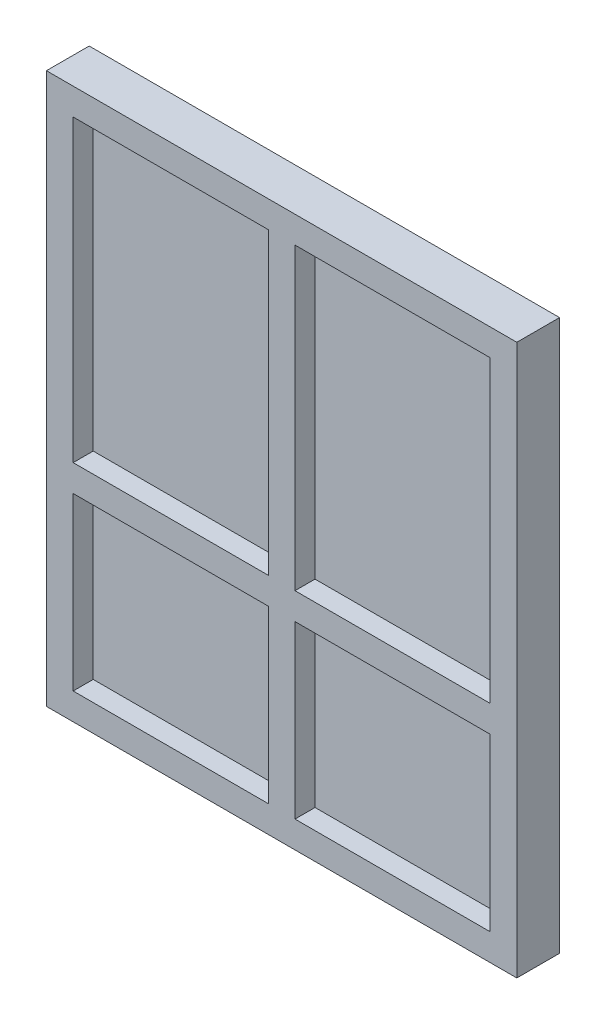
ISO-10303-21;
HEADER;
FILE_DESCRIPTION(('STEP AP214'),'2;1');
FILE_NAME('part.step','',(''),(''),'','','');
FILE_SCHEMA(('AUTOMOTIVE_DESIGN { 1 0 10303 214 1 1 1 1 }'));
ENDSEC;
DATA;
#1=APPLICATION_CONTEXT('core data for automotive mechanical design processes');
#2=APPLICATION_PROTOCOL_DEFINITION('international standard','automotive_design',2000,#1);
#3=PRODUCT_CONTEXT('',#1,'mechanical');
#4=PRODUCT('Part','Part','',(#3));
#5=PRODUCT_RELATED_PRODUCT_CATEGORY('part','',(#4));
#6=PRODUCT_DEFINITION_FORMATION('','',#4);
#7=PRODUCT_DEFINITION_CONTEXT('part definition',#1,'design');
#8=PRODUCT_DEFINITION('design','',#6,#7);
#9=PRODUCT_DEFINITION_SHAPE('','',#8);
#10=(LENGTH_UNIT() NAMED_UNIT(*) SI_UNIT(.MILLI.,.METRE.));
#11=(NAMED_UNIT(*) PLANE_ANGLE_UNIT() SI_UNIT($,.RADIAN.));
#12=(NAMED_UNIT(*) SI_UNIT($,.STERADIAN.) SOLID_ANGLE_UNIT());
#13=UNCERTAINTY_MEASURE_WITH_UNIT(LENGTH_MEASURE(1.E-05),#10,'distance_accuracy_value','');
#14=(GEOMETRIC_REPRESENTATION_CONTEXT(3) GLOBAL_UNCERTAINTY_ASSIGNED_CONTEXT((#13)) GLOBAL_UNIT_ASSIGNED_CONTEXT((#10,
#11,#12)) REPRESENTATION_CONTEXT('',''));
#15=CARTESIAN_POINT('',(0.,0.,0.));
#16=DIRECTION('',(0.,0.,1.));
#17=DIRECTION('',(1.,0.,0.));
#18=AXIS2_PLACEMENT_3D('',#15,#16,#17);
#19=CARTESIAN_POINT('',(100.,1960.,5.));
#20=DIRECTION('',(1.,0.,0.));
#21=DIRECTION('',(0.,1.,0.));
#22=AXIS2_PLACEMENT_3D('',#19,#20,#21);
#23=PLANE('',#22);
#24=DIRECTION('',(0.,-1.,0.));
#25=VECTOR('',#24,1.);
#26=CARTESIAN_POINT('',(100.,1960.,-5.));
#27=LINE('',#26,#25);
#28=CARTESIAN_POINT('',(100.,1960.,-5.));
#29=VERTEX_POINT('',#28);
#30=CARTESIAN_POINT('',(100.,100.,-5.));
#31=VERTEX_POINT('',#30);
#32=EDGE_CURVE('E110',#29,#31,#27,.T.);
#33=ORIENTED_EDGE('',*,*,#32,.T.);
#34=DIRECTION('',(0.,0.,-1.));
#35=VECTOR('',#34,1.);
#36=CARTESIAN_POINT('',(100.,100.,5.));
#37=LINE('',#36,#35);
#38=CARTESIAN_POINT('',(100.,100.,5.));
#39=VERTEX_POINT('',#38);
#40=EDGE_CURVE('E12',#39,#31,#37,.T.);
#41=ORIENTED_EDGE('',*,*,#40,.F.);
#42=DIRECTION('',(0.,-1.,0.));
#43=VECTOR('',#42,1.);
#44=CARTESIAN_POINT('',(100.,1960.,5.));
#45=LINE('',#44,#43);
#46=CARTESIAN_POINT('',(100.,1960.,5.));
#47=VERTEX_POINT('',#46);
#48=EDGE_CURVE('E98',#47,#39,#45,.T.);
#49=ORIENTED_EDGE('',*,*,#48,.F.);
#50=DIRECTION('',(0.,0.,-1.));
#51=VECTOR('',#50,1.);
#52=CARTESIAN_POINT('',(100.,1960.,5.));
#53=LINE('',#52,#51);
#54=EDGE_CURVE('E106',#47,#29,#53,.T.);
#55=ORIENTED_EDGE('',*,*,#54,.T.);
#56=EDGE_LOOP('',(#33,#41,#49,#55));
#57=FACE_BOUND('',#56,.T.);
#58=ADVANCED_FACE('F47',(#57),#23,.F.);
#59=CARTESIAN_POINT('',(100.,100.,5.));
#60=DIRECTION('',(0.,1.,0.));
#61=DIRECTION('',(0.,0.,1.));
#62=AXIS2_PLACEMENT_3D('',#59,#60,#61);
#63=PLANE('',#62);
#64=DIRECTION('',(1.,0.,0.));
#65=VECTOR('',#64,1.);
#66=CARTESIAN_POINT('',(100.,100.,-5.));
#67=LINE('',#66,#65);
#68=CARTESIAN_POINT('',(1660.,100.,-5.));
#69=VERTEX_POINT('',#68);
#70=EDGE_CURVE('E102',#31,#69,#67,.T.);
#71=ORIENTED_EDGE('',*,*,#70,.T.);
#72=DIRECTION('',(0.,0.,-1.));
#73=VECTOR('',#72,1.);
#74=CARTESIAN_POINT('',(1660.,100.,5.));
#75=LINE('',#74,#73);
#76=CARTESIAN_POINT('',(1660.,100.,5.));
#77=VERTEX_POINT('',#76);
#78=EDGE_CURVE('E55',#77,#69,#75,.T.);
#79=ORIENTED_EDGE('',*,*,#78,.F.);
#80=DIRECTION('',(1.,0.,0.));
#81=VECTOR('',#80,1.);
#82=CARTESIAN_POINT('',(100.,100.,5.));
#83=LINE('',#82,#81);
#84=EDGE_CURVE('E93',#39,#77,#83,.T.);
#85=ORIENTED_EDGE('',*,*,#84,.F.);
#86=ORIENTED_EDGE('',*,*,#40,.T.);
#87=EDGE_LOOP('',(#71,#79,#85,#86));
#88=FACE_BOUND('',#87,.T.);
#89=ADVANCED_FACE('F101',(#88),#63,.F.);
#90=CARTESIAN_POINT('',(1660.,1960.,5.));
#91=DIRECTION('',(-1.,0.,0.));
#92=DIRECTION('',(0.,-1.,0.));
#93=AXIS2_PLACEMENT_3D('',#90,#91,#92);
#94=PLANE('',#93);
#95=DIRECTION('',(0.,1.,0.));
#96=VECTOR('',#95,1.);
#97=CARTESIAN_POINT('',(1660.,1960.,-5.));
#98=LINE('',#97,#96);
#99=CARTESIAN_POINT('',(1660.,1960.,-5.));
#100=VERTEX_POINT('',#99);
#101=EDGE_CURVE('E80',#69,#100,#98,.T.);
#102=ORIENTED_EDGE('',*,*,#101,.T.);
#103=DIRECTION('',(0.,0.,-1.));
#104=VECTOR('',#103,1.);
#105=CARTESIAN_POINT('',(1660.,1960.,5.));
#106=LINE('',#105,#104);
#107=CARTESIAN_POINT('',(1660.,1960.,5.));
#108=VERTEX_POINT('',#107);
#109=EDGE_CURVE('E103',#108,#100,#106,.T.);
#110=ORIENTED_EDGE('',*,*,#109,.F.);
#111=DIRECTION('',(0.,1.,0.));
#112=VECTOR('',#111,1.);
#113=CARTESIAN_POINT('',(1660.,1960.,5.));
#114=LINE('',#113,#112);
#115=EDGE_CURVE('E96',#77,#108,#114,.T.);
#116=ORIENTED_EDGE('',*,*,#115,.F.);
#117=ORIENTED_EDGE('',*,*,#78,.T.);
#118=EDGE_LOOP('',(#102,#110,#116,#117));
#119=FACE_BOUND('',#118,.T.);
#120=ADVANCED_FACE('F104',(#119),#94,.F.);
#121=CARTESIAN_POINT('',(100.,1960.,5.));
#122=DIRECTION('',(0.,-1.,0.));
#123=DIRECTION('',(0.,0.,-1.));
#124=AXIS2_PLACEMENT_3D('',#121,#122,#123);
#125=PLANE('',#124);
#126=DIRECTION('',(-1.,0.,0.));
#127=VECTOR('',#126,1.);
#128=CARTESIAN_POINT('',(100.,1960.,-5.));
#129=LINE('',#128,#127);
#130=EDGE_CURVE('E86',#100,#29,#129,.T.);
#131=ORIENTED_EDGE('',*,*,#130,.T.);
#132=ORIENTED_EDGE('',*,*,#54,.F.);
#133=DIRECTION('',(-1.,0.,0.));
#134=VECTOR('',#133,1.);
#135=CARTESIAN_POINT('',(100.,1960.,5.));
#136=LINE('',#135,#134);
#137=EDGE_CURVE('E63',#108,#47,#136,.T.);
#138=ORIENTED_EDGE('',*,*,#137,.F.);
#139=ORIENTED_EDGE('',*,*,#109,.T.);
#140=EDGE_LOOP('',(#131,#132,#138,#139));
#141=FACE_BOUND('',#140,.T.);
#142=ADVANCED_FACE('F117',(#141),#125,.F.);
#143=CARTESIAN_POINT('',(0.,0.,5.));
#144=DIRECTION('',(0.,0.,1.));
#145=DIRECTION('',(1.,0.,0.));
#146=AXIS2_PLACEMENT_3D('',#143,#144,#145);
#147=PLANE('',#146);
#148=ORIENTED_EDGE('',*,*,#48,.T.);
#149=ORIENTED_EDGE('',*,*,#84,.T.);
#150=ORIENTED_EDGE('',*,*,#115,.T.);
#151=ORIENTED_EDGE('',*,*,#137,.T.);
#152=EDGE_LOOP('',(#148,#149,#150,#151));
#153=FACE_BOUND('',#152,.T.);
#154=ADVANCED_FACE('F94',(#153),#147,.T.);
#155=CARTESIAN_POINT('',(0.,0.,-5.));
#156=DIRECTION('',(0.,0.,1.));
#157=DIRECTION('',(1.,0.,0.));
#158=AXIS2_PLACEMENT_3D('',#155,#156,#157);
#159=PLANE('',#158);
#160=ORIENTED_EDGE('',*,*,#32,.F.);
#161=ORIENTED_EDGE('',*,*,#130,.F.);
#162=ORIENTED_EDGE('',*,*,#101,.F.);
#163=ORIENTED_EDGE('',*,*,#70,.F.);
#164=EDGE_LOOP('',(#160,#161,#162,#163));
#165=FACE_BOUND('',#164,.T.);
#166=ADVANCED_FACE('F120',(#165),#159,.F.);
#167=CLOSED_SHELL('',(#58,#89,#120,#142,#154,#166));
#168=MANIFOLD_SOLID_BREP('B2',#167);
#169=CARTESIAN_POINT('',(0.,0.,80.));
#170=DIRECTION('',(0.,0.,1.));
#171=DIRECTION('',(1.,0.,0.));
#172=AXIS2_PLACEMENT_3D('',#169,#170,#171);
#173=PLANE('',#172);
#174=DIRECTION('',(0.,-1.,0.));
#175=VECTOR('',#174,1.);
#176=CARTESIAN_POINT('',(0.,2060.,80.));
#177=LINE('',#176,#175);
#178=CARTESIAN_POINT('',(0.,2060.,80.));
#179=VERTEX_POINT('',#178);
#180=CARTESIAN_POINT('',(0.,0.,80.));
#181=VERTEX_POINT('',#180);
#182=EDGE_CURVE('E437',#179,#181,#177,.T.);
#183=ORIENTED_EDGE('',*,*,#182,.T.);
#184=DIRECTION('',(1.,0.,0.));
#185=VECTOR('',#184,1.);
#186=CARTESIAN_POINT('',(0.,0.,80.));
#187=LINE('',#186,#185);
#188=CARTESIAN_POINT('',(1760.,0.,80.));
#189=VERTEX_POINT('',#188);
#190=EDGE_CURVE('E440',#181,#189,#187,.T.);
#191=ORIENTED_EDGE('',*,*,#190,.T.);
#192=DIRECTION('',(0.,1.,0.));
#193=VECTOR('',#192,1.);
#194=CARTESIAN_POINT('',(1760.,2060.,80.));
#195=LINE('',#194,#193);
#196=CARTESIAN_POINT('',(1760.,2060.,80.));
#197=VERTEX_POINT('',#196);
#198=EDGE_CURVE('E443',#189,#197,#195,.T.);
#199=ORIENTED_EDGE('',*,*,#198,.T.);
#200=DIRECTION('',(-1.,0.,0.));
#201=VECTOR('',#200,1.);
#202=CARTESIAN_POINT('',(0.,2060.,80.));
#203=LINE('',#202,#201);
#204=EDGE_CURVE('E445',#197,#179,#203,.T.);
#205=ORIENTED_EDGE('',*,*,#204,.T.);
#206=EDGE_LOOP('',(#183,#191,#199,#205));
#207=FACE_BOUND('',#206,.T.);
#208=DIRECTION('',(1.,0.,0.));
#209=VECTOR('',#208,1.);
#210=CARTESIAN_POINT('',(100.,100.,80.));
#211=LINE('',#210,#209);
#212=CARTESIAN_POINT('',(100.,100.,80.));
#213=VERTEX_POINT('',#212);
#214=CARTESIAN_POINT('',(830.,100.,80.));
#215=VERTEX_POINT('',#214);
#216=EDGE_CURVE('E408',#213,#215,#211,.T.);
#217=ORIENTED_EDGE('',*,*,#216,.F.);
#218=DIRECTION('',(0.,-1.,0.));
#219=VECTOR('',#218,1.);
#220=CARTESIAN_POINT('',(100.,740.,80.));
#221=LINE('',#220,#219);
#222=CARTESIAN_POINT('',(100.,740.,80.));
#223=VERTEX_POINT('',#222);
#224=EDGE_CURVE('E406',#223,#213,#221,.T.);
#225=ORIENTED_EDGE('',*,*,#224,.F.);
#226=DIRECTION('',(-1.,0.,0.));
#227=VECTOR('',#226,1.);
#228=CARTESIAN_POINT('',(100.,740.,80.));
#229=LINE('',#228,#227);
#230=CARTESIAN_POINT('',(830.,740.,80.));
#231=VERTEX_POINT('',#230);
#232=EDGE_CURVE('E414',#231,#223,#229,.T.);
#233=ORIENTED_EDGE('',*,*,#232,.F.);
#234=DIRECTION('',(0.,1.,0.));
#235=VECTOR('',#234,1.);
#236=CARTESIAN_POINT('',(830.,740.,80.));
#237=LINE('',#236,#235);
#238=EDGE_CURVE('E411',#215,#231,#237,.T.);
#239=ORIENTED_EDGE('',*,*,#238,.F.);
#240=EDGE_LOOP('',(#217,#225,#233,#239));
#241=FACE_BOUND('',#240,.T.);
#242=DIRECTION('',(1.,0.,0.));
#243=VECTOR('',#242,1.);
#244=CARTESIAN_POINT('',(100.,840.,80.));
#245=LINE('',#244,#243);
#246=CARTESIAN_POINT('',(100.,840.,80.));
#247=VERTEX_POINT('',#246);
#248=CARTESIAN_POINT('',(830.,840.,80.));
#249=VERTEX_POINT('',#248);
#250=EDGE_CURVE('E377',#247,#249,#245,.T.);
#251=ORIENTED_EDGE('',*,*,#250,.F.);
#252=DIRECTION('',(0.,-1.,0.));
#253=VECTOR('',#252,1.);
#254=CARTESIAN_POINT('',(100.,1960.,80.));
#255=LINE('',#254,#253);
#256=CARTESIAN_POINT('',(100.,1960.,80.));
#257=VERTEX_POINT('',#256);
#258=EDGE_CURVE('E375',#257,#247,#255,.T.);
#259=ORIENTED_EDGE('',*,*,#258,.F.);
#260=DIRECTION('',(-1.,0.,0.));
#261=VECTOR('',#260,1.);
#262=CARTESIAN_POINT('',(100.,1960.,80.));
#263=LINE('',#262,#261);
#264=CARTESIAN_POINT('',(830.,1960.,80.));
#265=VERTEX_POINT('',#264);
#266=EDGE_CURVE('E383',#265,#257,#263,.T.);
#267=ORIENTED_EDGE('',*,*,#266,.F.);
#268=DIRECTION('',(0.,1.,0.));
#269=VECTOR('',#268,1.);
#270=CARTESIAN_POINT('',(830.,1960.,80.));
#271=LINE('',#270,#269);
#272=EDGE_CURVE('E380',#249,#265,#271,.T.);
#273=ORIENTED_EDGE('',*,*,#272,.F.);
#274=EDGE_LOOP('',(#251,#259,#267,#273));
#275=FACE_BOUND('',#274,.T.);
#276=DIRECTION('',(1.,0.,0.));
#277=VECTOR('',#276,1.);
#278=CARTESIAN_POINT('',(930.,840.,80.));
#279=LINE('',#278,#277);
#280=CARTESIAN_POINT('',(930.,840.,80.));
#281=VERTEX_POINT('',#280);
#282=CARTESIAN_POINT('',(1660.,840.,80.));
#283=VERTEX_POINT('',#282);
#284=EDGE_CURVE('E346',#281,#283,#279,.T.);
#285=ORIENTED_EDGE('',*,*,#284,.F.);
#286=DIRECTION('',(0.,-1.,0.));
#287=VECTOR('',#286,1.);
#288=CARTESIAN_POINT('',(930.,1960.,80.));
#289=LINE('',#288,#287);
#290=CARTESIAN_POINT('',(930.,1960.,80.));
#291=VERTEX_POINT('',#290);
#292=EDGE_CURVE('E344',#291,#281,#289,.T.);
#293=ORIENTED_EDGE('',*,*,#292,.F.);
#294=DIRECTION('',(-1.,0.,0.));
#295=VECTOR('',#294,1.);
#296=CARTESIAN_POINT('',(930.,1960.,80.));
#297=LINE('',#296,#295);
#298=CARTESIAN_POINT('',(1660.,1960.,80.));
#299=VERTEX_POINT('',#298);
#300=EDGE_CURVE('E352',#299,#291,#297,.T.);
#301=ORIENTED_EDGE('',*,*,#300,.F.);
#302=DIRECTION('',(0.,1.,0.));
#303=VECTOR('',#302,1.);
#304=CARTESIAN_POINT('',(1660.,1960.,80.));
#305=LINE('',#304,#303);
#306=EDGE_CURVE('E349',#283,#299,#305,.T.);
#307=ORIENTED_EDGE('',*,*,#306,.F.);
#308=EDGE_LOOP('',(#285,#293,#301,#307));
#309=FACE_BOUND('',#308,.T.);
#310=DIRECTION('',(1.,0.,0.));
#311=VECTOR('',#310,1.);
#312=CARTESIAN_POINT('',(930.,100.,80.));
#313=LINE('',#312,#311);
#314=CARTESIAN_POINT('',(930.,100.,80.));
#315=VERTEX_POINT('',#314);
#316=CARTESIAN_POINT('',(1660.,100.,80.));
#317=VERTEX_POINT('',#316);
#318=EDGE_CURVE('E316',#315,#317,#313,.T.);
#319=ORIENTED_EDGE('',*,*,#318,.F.);
#320=DIRECTION('',(0.,-1.,0.));
#321=VECTOR('',#320,1.);
#322=CARTESIAN_POINT('',(930.,740.,80.));
#323=LINE('',#322,#321);
#324=CARTESIAN_POINT('',(930.,740.,80.));
#325=VERTEX_POINT('',#324);
#326=EDGE_CURVE('E308',#325,#315,#323,.T.);
#327=ORIENTED_EDGE('',*,*,#326,.F.);
#328=DIRECTION('',(-1.,0.,0.));
#329=VECTOR('',#328,1.);
#330=CARTESIAN_POINT('',(930.,740.,80.));
#331=LINE('',#330,#329);
#332=CARTESIAN_POINT('',(1660.,740.,80.));
#333=VERTEX_POINT('',#332);
#334=EDGE_CURVE('E330',#333,#325,#331,.T.);
#335=ORIENTED_EDGE('',*,*,#334,.F.);
#336=DIRECTION('',(0.,1.,0.));
#337=VECTOR('',#336,1.);
#338=CARTESIAN_POINT('',(1660.,740.,80.));
#339=LINE('',#338,#337);
#340=EDGE_CURVE('E328',#317,#333,#339,.T.);
#341=ORIENTED_EDGE('',*,*,#340,.F.);
#342=EDGE_LOOP('',(#319,#327,#335,#341));
#343=FACE_BOUND('',#342,.T.);
#344=ADVANCED_FACE('F171',(#207,#241,#275,#309,#343),#173,.T.);
#345=CARTESIAN_POINT('',(0.,0.,-80.));
#346=DIRECTION('',(0.,0.,1.));
#347=DIRECTION('',(1.,0.,0.));
#348=AXIS2_PLACEMENT_3D('',#345,#346,#347);
#349=PLANE('',#348);
#350=DIRECTION('',(0.,-1.,0.));
#351=VECTOR('',#350,1.);
#352=CARTESIAN_POINT('',(930.,1960.,-80.));
#353=LINE('',#352,#351);
#354=CARTESIAN_POINT('',(930.,1960.,-80.));
#355=VERTEX_POINT('',#354);
#356=CARTESIAN_POINT('',(930.,840.,-80.));
#357=VERTEX_POINT('',#356);
#358=EDGE_CURVE('E324',#355,#357,#353,.T.);
#359=ORIENTED_EDGE('',*,*,#358,.T.);
#360=DIRECTION('',(1.,0.,0.));
#361=VECTOR('',#360,1.);
#362=CARTESIAN_POINT('',(930.,840.,-80.));
#363=LINE('',#362,#361);
#364=CARTESIAN_POINT('',(1660.,840.,-80.));
#365=VERTEX_POINT('',#364);
#366=EDGE_CURVE('E357',#357,#365,#363,.T.);
#367=ORIENTED_EDGE('',*,*,#366,.T.);
#368=DIRECTION('',(0.,1.,0.));
#369=VECTOR('',#368,1.);
#370=CARTESIAN_POINT('',(1660.,1960.,-80.));
#371=LINE('',#370,#369);
#372=CARTESIAN_POINT('',(1660.,1960.,-80.));
#373=VERTEX_POINT('',#372);
#374=EDGE_CURVE('E360',#365,#373,#371,.T.);
#375=ORIENTED_EDGE('',*,*,#374,.T.);
#376=DIRECTION('',(-1.,0.,0.));
#377=VECTOR('',#376,1.);
#378=CARTESIAN_POINT('',(930.,1960.,-80.));
#379=LINE('',#378,#377);
#380=EDGE_CURVE('E347',#373,#355,#379,.T.);
#381=ORIENTED_EDGE('',*,*,#380,.T.);
#382=EDGE_LOOP('',(#359,#367,#375,#381));
#383=FACE_BOUND('',#382,.T.);
#384=DIRECTION('',(0.,-1.,0.));
#385=VECTOR('',#384,1.);
#386=CARTESIAN_POINT('',(100.,740.,-80.));
#387=LINE('',#386,#385);
#388=CARTESIAN_POINT('',(100.,740.,-80.));
#389=VERTEX_POINT('',#388);
#390=CARTESIAN_POINT('',(100.,100.,-80.));
#391=VERTEX_POINT('',#390);
#392=EDGE_CURVE('E405',#389,#391,#387,.T.);
#393=ORIENTED_EDGE('',*,*,#392,.T.);
#394=DIRECTION('',(1.,0.,0.));
#395=VECTOR('',#394,1.);
#396=CARTESIAN_POINT('',(100.,100.,-80.));
#397=LINE('',#396,#395);
#398=CARTESIAN_POINT('',(830.,100.,-80.));
#399=VERTEX_POINT('',#398);
#400=EDGE_CURVE('E419',#391,#399,#397,.T.);
#401=ORIENTED_EDGE('',*,*,#400,.T.);
#402=DIRECTION('',(0.,1.,0.));
#403=VECTOR('',#402,1.);
#404=CARTESIAN_POINT('',(830.,740.,-80.));
#405=LINE('',#404,#403);
#406=CARTESIAN_POINT('',(830.,740.,-80.));
#407=VERTEX_POINT('',#406);
#408=EDGE_CURVE('E422',#399,#407,#405,.T.);
#409=ORIENTED_EDGE('',*,*,#408,.T.);
#410=DIRECTION('',(-1.,0.,0.));
#411=VECTOR('',#410,1.);
#412=CARTESIAN_POINT('',(100.,740.,-80.));
#413=LINE('',#412,#411);
#414=EDGE_CURVE('E409',#407,#389,#413,.T.);
#415=ORIENTED_EDGE('',*,*,#414,.T.);
#416=EDGE_LOOP('',(#393,#401,#409,#415));
#417=FACE_BOUND('',#416,.T.);
#418=DIRECTION('',(0.,-1.,0.));
#419=VECTOR('',#418,1.);
#420=CARTESIAN_POINT('',(0.,2060.,-80.));
#421=LINE('',#420,#419);
#422=CARTESIAN_POINT('',(0.,2060.,-80.));
#423=VERTEX_POINT('',#422);
#424=CARTESIAN_POINT('',(0.,0.,-80.));
#425=VERTEX_POINT('',#424);
#426=EDGE_CURVE('E436',#423,#425,#421,.T.);
#427=ORIENTED_EDGE('',*,*,#426,.F.);
#428=DIRECTION('',(-1.,0.,0.));
#429=VECTOR('',#428,1.);
#430=CARTESIAN_POINT('',(0.,2060.,-80.));
#431=LINE('',#430,#429);
#432=CARTESIAN_POINT('',(1760.,2060.,-80.));
#433=VERTEX_POINT('',#432);
#434=EDGE_CURVE('E441',#433,#423,#431,.T.);
#435=ORIENTED_EDGE('',*,*,#434,.F.);
#436=DIRECTION('',(0.,1.,0.));
#437=VECTOR('',#436,1.);
#438=CARTESIAN_POINT('',(1760.,2060.,-80.));
#439=LINE('',#438,#437);
#440=CARTESIAN_POINT('',(1760.,0.,-80.));
#441=VERTEX_POINT('',#440);
#442=EDGE_CURVE('E452',#441,#433,#439,.T.);
#443=ORIENTED_EDGE('',*,*,#442,.F.);
#444=DIRECTION('',(1.,0.,0.));
#445=VECTOR('',#444,1.);
#446=CARTESIAN_POINT('',(0.,0.,-80.));
#447=LINE('',#446,#445);
#448=EDGE_CURVE('E450',#425,#441,#447,.T.);
#449=ORIENTED_EDGE('',*,*,#448,.F.);
#450=EDGE_LOOP('',(#427,#435,#443,#449));
#451=FACE_BOUND('',#450,.T.);
#452=DIRECTION('',(0.,-1.,0.));
#453=VECTOR('',#452,1.);
#454=CARTESIAN_POINT('',(100.,1960.,-80.));
#455=LINE('',#454,#453);
#456=CARTESIAN_POINT('',(100.,1960.,-80.));
#457=VERTEX_POINT('',#456);
#458=CARTESIAN_POINT('',(100.,840.,-80.));
#459=VERTEX_POINT('',#458);
#460=EDGE_CURVE('E374',#457,#459,#455,.T.);
#461=ORIENTED_EDGE('',*,*,#460,.T.);
#462=DIRECTION('',(1.,0.,0.));
#463=VECTOR('',#462,1.);
#464=CARTESIAN_POINT('',(100.,840.,-80.));
#465=LINE('',#464,#463);
#466=CARTESIAN_POINT('',(830.,840.,-80.));
#467=VERTEX_POINT('',#466);
#468=EDGE_CURVE('E388',#459,#467,#465,.T.);
#469=ORIENTED_EDGE('',*,*,#468,.T.);
#470=DIRECTION('',(0.,1.,0.));
#471=VECTOR('',#470,1.);
#472=CARTESIAN_POINT('',(830.,1960.,-80.));
#473=LINE('',#472,#471);
#474=CARTESIAN_POINT('',(830.,1960.,-80.));
#475=VERTEX_POINT('',#474);
#476=EDGE_CURVE('E391',#467,#475,#473,.T.);
#477=ORIENTED_EDGE('',*,*,#476,.T.);
#478=DIRECTION('',(-1.,0.,0.));
#479=VECTOR('',#478,1.);
#480=CARTESIAN_POINT('',(100.,1960.,-80.));
#481=LINE('',#480,#479);
#482=EDGE_CURVE('E378',#475,#457,#481,.T.);
#483=ORIENTED_EDGE('',*,*,#482,.T.);
#484=EDGE_LOOP('',(#461,#469,#477,#483));
#485=FACE_BOUND('',#484,.T.);
#486=DIRECTION('',(0.,-1.,0.));
#487=VECTOR('',#486,1.);
#488=CARTESIAN_POINT('',(930.,740.,-80.));
#489=LINE('',#488,#487);
#490=CARTESIAN_POINT('',(930.,740.,-80.));
#491=VERTEX_POINT('',#490);
#492=CARTESIAN_POINT('',(930.,100.,-80.));
#493=VERTEX_POINT('',#492);
#494=EDGE_CURVE('E194',#491,#493,#489,.T.);
#495=ORIENTED_EDGE('',*,*,#494,.T.);
#496=DIRECTION('',(1.,0.,0.));
#497=VECTOR('',#496,1.);
#498=CARTESIAN_POINT('',(930.,100.,-80.));
#499=LINE('',#498,#497);
#500=CARTESIAN_POINT('',(1660.,100.,-80.));
#501=VERTEX_POINT('',#500);
#502=EDGE_CURVE('E323',#493,#501,#499,.T.);
#503=ORIENTED_EDGE('',*,*,#502,.T.);
#504=DIRECTION('',(0.,1.,0.));
#505=VECTOR('',#504,1.);
#506=CARTESIAN_POINT('',(1660.,740.,-80.));
#507=LINE('',#506,#505);
#508=CARTESIAN_POINT('',(1660.,740.,-80.));
#509=VERTEX_POINT('',#508);
#510=EDGE_CURVE('E336',#501,#509,#507,.T.);
#511=ORIENTED_EDGE('',*,*,#510,.T.);
#512=DIRECTION('',(-1.,0.,0.));
#513=VECTOR('',#512,1.);
#514=CARTESIAN_POINT('',(930.,740.,-80.));
#515=LINE('',#514,#513);
#516=EDGE_CURVE('E317',#509,#491,#515,.T.);
#517=ORIENTED_EDGE('',*,*,#516,.T.);
#518=EDGE_LOOP('',(#495,#503,#511,#517));
#519=FACE_BOUND('',#518,.T.);
#520=ADVANCED_FACE('F470',(#383,#417,#451,#485,#519),#349,.F.);
#521=CARTESIAN_POINT('',(0.,2060.,80.));
#522=DIRECTION('',(1.,0.,0.));
#523=DIRECTION('',(0.,1.,0.));
#524=AXIS2_PLACEMENT_3D('',#521,#522,#523);
#525=PLANE('',#524);
#526=ORIENTED_EDGE('',*,*,#426,.T.);
#527=DIRECTION('',(0.,0.,-1.));
#528=VECTOR('',#527,1.);
#529=CARTESIAN_POINT('',(0.,0.,80.));
#530=LINE('',#529,#528);
#531=EDGE_CURVE('E45',#181,#425,#530,.T.);
#532=ORIENTED_EDGE('',*,*,#531,.F.);
#533=ORIENTED_EDGE('',*,*,#182,.F.);
#534=DIRECTION('',(0.,0.,-1.));
#535=VECTOR('',#534,1.);
#536=CARTESIAN_POINT('',(0.,2060.,80.));
#537=LINE('',#536,#535);
#538=EDGE_CURVE('E447',#179,#423,#537,.T.);
#539=ORIENTED_EDGE('',*,*,#538,.T.);
#540=EDGE_LOOP('',(#526,#532,#533,#539));
#541=FACE_BOUND('',#540,.T.);
#542=ADVANCED_FACE('F173',(#541),#525,.F.);
#543=CARTESIAN_POINT('',(0.,0.,80.));
#544=DIRECTION('',(0.,1.,0.));
#545=DIRECTION('',(0.,0.,1.));
#546=AXIS2_PLACEMENT_3D('',#543,#544,#545);
#547=PLANE('',#546);
#548=ORIENTED_EDGE('',*,*,#448,.T.);
#549=DIRECTION('',(0.,0.,-1.));
#550=VECTOR('',#549,1.);
#551=CARTESIAN_POINT('',(1760.,0.,80.));
#552=LINE('',#551,#550);
#553=EDGE_CURVE('E179',#189,#441,#552,.T.);
#554=ORIENTED_EDGE('',*,*,#553,.F.);
#555=ORIENTED_EDGE('',*,*,#190,.F.);
#556=ORIENTED_EDGE('',*,*,#531,.T.);
#557=EDGE_LOOP('',(#548,#554,#555,#556));
#558=FACE_BOUND('',#557,.T.);
#559=ADVANCED_FACE('F481',(#558),#547,.F.);
#560=CARTESIAN_POINT('',(1760.,2060.,80.));
#561=DIRECTION('',(-1.,0.,0.));
#562=DIRECTION('',(0.,0.,1.));
#563=AXIS2_PLACEMENT_3D('',#560,#561,#562);
#564=PLANE('',#563);
#565=ORIENTED_EDGE('',*,*,#442,.T.);
#566=DIRECTION('',(0.,0.,-1.));
#567=VECTOR('',#566,1.);
#568=CARTESIAN_POINT('',(1760.,2060.,80.));
#569=LINE('',#568,#567);
#570=EDGE_CURVE('E457',#197,#433,#569,.T.);
#571=ORIENTED_EDGE('',*,*,#570,.F.);
#572=ORIENTED_EDGE('',*,*,#198,.F.);
#573=ORIENTED_EDGE('',*,*,#553,.T.);
#574=EDGE_LOOP('',(#565,#571,#572,#573));
#575=FACE_BOUND('',#574,.T.);
#576=ADVANCED_FACE('F464',(#575),#564,.F.);
#577=CARTESIAN_POINT('',(0.,2060.,80.));
#578=DIRECTION('',(0.,-1.,0.));
#579=DIRECTION('',(0.,0.,-1.));
#580=AXIS2_PLACEMENT_3D('',#577,#578,#579);
#581=PLANE('',#580);
#582=ORIENTED_EDGE('',*,*,#434,.T.);
#583=ORIENTED_EDGE('',*,*,#538,.F.);
#584=ORIENTED_EDGE('',*,*,#204,.F.);
#585=ORIENTED_EDGE('',*,*,#570,.T.);
#586=EDGE_LOOP('',(#582,#583,#584,#585));
#587=FACE_BOUND('',#586,.T.);
#588=ADVANCED_FACE('F474',(#587),#581,.F.);
#589=CARTESIAN_POINT('',(100.,740.,80.));
#590=DIRECTION('',(1.,0.,0.));
#591=DIRECTION('',(0.,1.,0.));
#592=AXIS2_PLACEMENT_3D('',#589,#590,#591);
#593=PLANE('',#592);
#594=ORIENTED_EDGE('',*,*,#392,.F.);
#595=DIRECTION('',(0.,0.,-1.));
#596=VECTOR('',#595,1.);
#597=CARTESIAN_POINT('',(100.,740.,80.));
#598=LINE('',#597,#596);
#599=EDGE_CURVE('E416',#223,#389,#598,.T.);
#600=ORIENTED_EDGE('',*,*,#599,.F.);
#601=ORIENTED_EDGE('',*,*,#224,.T.);
#602=DIRECTION('',(0.,0.,-1.));
#603=VECTOR('',#602,1.);
#604=CARTESIAN_POINT('',(100.,100.,80.));
#605=LINE('',#604,#603);
#606=EDGE_CURVE('E433',#213,#391,#605,.T.);
#607=ORIENTED_EDGE('',*,*,#606,.T.);
#608=EDGE_LOOP('',(#594,#600,#601,#607));
#609=FACE_BOUND('',#608,.T.);
#610=ADVANCED_FACE('F496',(#609),#593,.T.);
#611=CARTESIAN_POINT('',(100.,100.,80.));
#612=DIRECTION('',(0.,1.,0.));
#613=DIRECTION('',(-1.,0.,0.));
#614=AXIS2_PLACEMENT_3D('',#611,#612,#613);
#615=PLANE('',#614);
#616=ORIENTED_EDGE('',*,*,#400,.F.);
#617=ORIENTED_EDGE('',*,*,#606,.F.);
#618=ORIENTED_EDGE('',*,*,#216,.T.);
#619=DIRECTION('',(0.,0.,-1.));
#620=VECTOR('',#619,1.);
#621=CARTESIAN_POINT('',(830.,100.,80.));
#622=LINE('',#621,#620);
#623=EDGE_CURVE('E431',#215,#399,#622,.T.);
#624=ORIENTED_EDGE('',*,*,#623,.T.);
#625=EDGE_LOOP('',(#616,#617,#618,#624));
#626=FACE_BOUND('',#625,.T.);
#627=ADVANCED_FACE('F503',(#626),#615,.T.);
#628=CARTESIAN_POINT('',(830.,740.,80.));
#629=DIRECTION('',(-1.,0.,0.));
#630=DIRECTION('',(0.,0.,1.));
#631=AXIS2_PLACEMENT_3D('',#628,#629,#630);
#632=PLANE('',#631);
#633=ORIENTED_EDGE('',*,*,#408,.F.);
#634=ORIENTED_EDGE('',*,*,#623,.F.);
#635=ORIENTED_EDGE('',*,*,#238,.T.);
#636=DIRECTION('',(0.,0.,-1.));
#637=VECTOR('',#636,1.);
#638=CARTESIAN_POINT('',(830.,740.,80.));
#639=LINE('',#638,#637);
#640=EDGE_CURVE('E429',#231,#407,#639,.T.);
#641=ORIENTED_EDGE('',*,*,#640,.T.);
#642=EDGE_LOOP('',(#633,#634,#635,#641));
#643=FACE_BOUND('',#642,.T.);
#644=ADVANCED_FACE('F508',(#643),#632,.T.);
#645=CARTESIAN_POINT('',(100.,740.,80.));
#646=DIRECTION('',(0.,-1.,0.));
#647=DIRECTION('',(0.,0.,-1.));
#648=AXIS2_PLACEMENT_3D('',#645,#646,#647);
#649=PLANE('',#648);
#650=ORIENTED_EDGE('',*,*,#414,.F.);
#651=ORIENTED_EDGE('',*,*,#640,.F.);
#652=ORIENTED_EDGE('',*,*,#232,.T.);
#653=ORIENTED_EDGE('',*,*,#599,.T.);
#654=EDGE_LOOP('',(#650,#651,#652,#653));
#655=FACE_BOUND('',#654,.T.);
#656=ADVANCED_FACE('F516',(#655),#649,.T.);
#657=CARTESIAN_POINT('',(100.,1960.,80.));
#658=DIRECTION('',(1.,0.,0.));
#659=DIRECTION('',(0.,1.,0.));
#660=AXIS2_PLACEMENT_3D('',#657,#658,#659);
#661=PLANE('',#660);
#662=ORIENTED_EDGE('',*,*,#460,.F.);
#663=DIRECTION('',(0.,0.,-1.));
#664=VECTOR('',#663,1.);
#665=CARTESIAN_POINT('',(100.,1960.,80.));
#666=LINE('',#665,#664);
#667=EDGE_CURVE('E385',#257,#457,#666,.T.);
#668=ORIENTED_EDGE('',*,*,#667,.F.);
#669=ORIENTED_EDGE('',*,*,#258,.T.);
#670=DIRECTION('',(0.,0.,-1.));
#671=VECTOR('',#670,1.);
#672=CARTESIAN_POINT('',(100.,840.,80.));
#673=LINE('',#672,#671);
#674=EDGE_CURVE('E402',#247,#459,#673,.T.);
#675=ORIENTED_EDGE('',*,*,#674,.T.);
#676=EDGE_LOOP('',(#662,#668,#669,#675));
#677=FACE_BOUND('',#676,.T.);
#678=ADVANCED_FACE('F570',(#677),#661,.T.);
#679=CARTESIAN_POINT('',(100.,840.,80.));
#680=DIRECTION('',(0.,1.,0.));
#681=DIRECTION('',(0.,0.,1.));
#682=AXIS2_PLACEMENT_3D('',#679,#680,#681);
#683=PLANE('',#682);
#684=ORIENTED_EDGE('',*,*,#468,.F.);
#685=ORIENTED_EDGE('',*,*,#674,.F.);
#686=ORIENTED_EDGE('',*,*,#250,.T.);
#687=DIRECTION('',(0.,0.,-1.));
#688=VECTOR('',#687,1.);
#689=CARTESIAN_POINT('',(830.,840.,80.));
#690=LINE('',#689,#688);
#691=EDGE_CURVE('E400',#249,#467,#690,.T.);
#692=ORIENTED_EDGE('',*,*,#691,.T.);
#693=EDGE_LOOP('',(#684,#685,#686,#692));
#694=FACE_BOUND('',#693,.T.);
#695=ADVANCED_FACE('F566',(#694),#683,.T.);
#696=CARTESIAN_POINT('',(830.,1960.,80.));
#697=DIRECTION('',(-1.,0.,0.));
#698=DIRECTION('',(0.,0.,1.));
#699=AXIS2_PLACEMENT_3D('',#696,#697,#698);
#700=PLANE('',#699);
#701=ORIENTED_EDGE('',*,*,#476,.F.);
#702=ORIENTED_EDGE('',*,*,#691,.F.);
#703=ORIENTED_EDGE('',*,*,#272,.T.);
#704=DIRECTION('',(0.,0.,-1.));
#705=VECTOR('',#704,1.);
#706=CARTESIAN_POINT('',(830.,1960.,80.));
#707=LINE('',#706,#705);
#708=EDGE_CURVE('E398',#265,#475,#707,.T.);
#709=ORIENTED_EDGE('',*,*,#708,.T.);
#710=EDGE_LOOP('',(#701,#702,#703,#709));
#711=FACE_BOUND('',#710,.T.);
#712=ADVANCED_FACE('F562',(#711),#700,.T.);
#713=CARTESIAN_POINT('',(100.,1960.,80.));
#714=DIRECTION('',(0.,-1.,0.));
#715=DIRECTION('',(0.,0.,-1.));
#716=AXIS2_PLACEMENT_3D('',#713,#714,#715);
#717=PLANE('',#716);
#718=ORIENTED_EDGE('',*,*,#482,.F.);
#719=ORIENTED_EDGE('',*,*,#708,.F.);
#720=ORIENTED_EDGE('',*,*,#266,.T.);
#721=ORIENTED_EDGE('',*,*,#667,.T.);
#722=EDGE_LOOP('',(#718,#719,#720,#721));
#723=FACE_BOUND('',#722,.T.);
#724=ADVANCED_FACE('F559',(#723),#717,.T.);
#725=CARTESIAN_POINT('',(930.,1960.,80.));
#726=DIRECTION('',(1.,0.,0.));
#727=DIRECTION('',(0.,1.,0.));
#728=AXIS2_PLACEMENT_3D('',#725,#726,#727);
#729=PLANE('',#728);
#730=ORIENTED_EDGE('',*,*,#358,.F.);
#731=DIRECTION('',(0.,0.,-1.));
#732=VECTOR('',#731,1.);
#733=CARTESIAN_POINT('',(930.,1960.,80.));
#734=LINE('',#733,#732);
#735=EDGE_CURVE('E354',#291,#355,#734,.T.);
#736=ORIENTED_EDGE('',*,*,#735,.F.);
#737=ORIENTED_EDGE('',*,*,#292,.T.);
#738=DIRECTION('',(0.,0.,-1.));
#739=VECTOR('',#738,1.);
#740=CARTESIAN_POINT('',(930.,840.,80.));
#741=LINE('',#740,#739);
#742=EDGE_CURVE('E371',#281,#357,#741,.T.);
#743=ORIENTED_EDGE('',*,*,#742,.T.);
#744=EDGE_LOOP('',(#730,#736,#737,#743));
#745=FACE_BOUND('',#744,.T.);
#746=ADVANCED_FACE('F541',(#745),#729,.T.);
#747=CARTESIAN_POINT('',(930.,840.,80.));
#748=DIRECTION('',(0.,1.,0.));
#749=DIRECTION('',(0.,0.,1.));
#750=AXIS2_PLACEMENT_3D('',#747,#748,#749);
#751=PLANE('',#750);
#752=ORIENTED_EDGE('',*,*,#366,.F.);
#753=ORIENTED_EDGE('',*,*,#742,.F.);
#754=ORIENTED_EDGE('',*,*,#284,.T.);
#755=DIRECTION('',(0.,0.,-1.));
#756=VECTOR('',#755,1.);
#757=CARTESIAN_POINT('',(1660.,840.,80.));
#758=LINE('',#757,#756);
#759=EDGE_CURVE('E369',#283,#365,#758,.T.);
#760=ORIENTED_EDGE('',*,*,#759,.T.);
#761=EDGE_LOOP('',(#752,#753,#754,#760));
#762=FACE_BOUND('',#761,.T.);
#763=ADVANCED_FACE('F535',(#762),#751,.T.);
#764=CARTESIAN_POINT('',(1660.,1960.,80.));
#765=DIRECTION('',(-1.,0.,0.));
#766=DIRECTION('',(0.,-1.,0.));
#767=AXIS2_PLACEMENT_3D('',#764,#765,#766);
#768=PLANE('',#767);
#769=ORIENTED_EDGE('',*,*,#374,.F.);
#770=ORIENTED_EDGE('',*,*,#759,.F.);
#771=ORIENTED_EDGE('',*,*,#306,.T.);
#772=DIRECTION('',(0.,0.,-1.));
#773=VECTOR('',#772,1.);
#774=CARTESIAN_POINT('',(1660.,1960.,80.));
#775=LINE('',#774,#773);
#776=EDGE_CURVE('E367',#299,#373,#775,.T.);
#777=ORIENTED_EDGE('',*,*,#776,.T.);
#778=EDGE_LOOP('',(#769,#770,#771,#777));
#779=FACE_BOUND('',#778,.T.);
#780=ADVANCED_FACE('F538',(#779),#768,.T.);
#781=CARTESIAN_POINT('',(930.,1960.,80.));
#782=DIRECTION('',(0.,-1.,0.));
#783=DIRECTION('',(0.,0.,-1.));
#784=AXIS2_PLACEMENT_3D('',#781,#782,#783);
#785=PLANE('',#784);
#786=ORIENTED_EDGE('',*,*,#380,.F.);
#787=ORIENTED_EDGE('',*,*,#776,.F.);
#788=ORIENTED_EDGE('',*,*,#300,.T.);
#789=ORIENTED_EDGE('',*,*,#735,.T.);
#790=EDGE_LOOP('',(#786,#787,#788,#789));
#791=FACE_BOUND('',#790,.T.);
#792=ADVANCED_FACE('F544',(#791),#785,.T.);
#793=CARTESIAN_POINT('',(930.,740.,80.));
#794=DIRECTION('',(1.,0.,0.));
#795=DIRECTION('',(0.,0.,-1.));
#796=AXIS2_PLACEMENT_3D('',#793,#794,#795);
#797=PLANE('',#796);
#798=ORIENTED_EDGE('',*,*,#494,.F.);
#799=DIRECTION('',(0.,0.,-1.));
#800=VECTOR('',#799,1.);
#801=CARTESIAN_POINT('',(930.,740.,80.));
#802=LINE('',#801,#800);
#803=EDGE_CURVE('E312',#325,#491,#802,.T.);
#804=ORIENTED_EDGE('',*,*,#803,.F.);
#805=ORIENTED_EDGE('',*,*,#326,.T.);
#806=DIRECTION('',(0.,0.,-1.));
#807=VECTOR('',#806,1.);
#808=CARTESIAN_POINT('',(930.,100.,80.));
#809=LINE('',#808,#807);
#810=EDGE_CURVE('E311',#315,#493,#809,.T.);
#811=ORIENTED_EDGE('',*,*,#810,.T.);
#812=EDGE_LOOP('',(#798,#804,#805,#811));
#813=FACE_BOUND('',#812,.T.);
#814=ADVANCED_FACE('F310',(#813),#797,.T.);
#815=CARTESIAN_POINT('',(930.,100.,80.));
#816=DIRECTION('',(0.,1.,0.));
#817=DIRECTION('',(0.,0.,1.));
#818=AXIS2_PLACEMENT_3D('',#815,#816,#817);
#819=PLANE('',#818);
#820=ORIENTED_EDGE('',*,*,#502,.F.);
#821=ORIENTED_EDGE('',*,*,#810,.F.);
#822=ORIENTED_EDGE('',*,*,#318,.T.);
#823=DIRECTION('',(0.,0.,-1.));
#824=VECTOR('',#823,1.);
#825=CARTESIAN_POINT('',(1660.,100.,80.));
#826=LINE('',#825,#824);
#827=EDGE_CURVE('E325',#317,#501,#826,.T.);
#828=ORIENTED_EDGE('',*,*,#827,.T.);
#829=EDGE_LOOP('',(#820,#821,#822,#828));
#830=FACE_BOUND('',#829,.T.);
#831=ADVANCED_FACE('F320',(#830),#819,.T.);
#832=CARTESIAN_POINT('',(1660.,740.,80.));
#833=DIRECTION('',(-1.,0.,0.));
#834=DIRECTION('',(0.,-1.,0.));
#835=AXIS2_PLACEMENT_3D('',#832,#833,#834);
#836=PLANE('',#835);
#837=ORIENTED_EDGE('',*,*,#510,.F.);
#838=ORIENTED_EDGE('',*,*,#827,.F.);
#839=ORIENTED_EDGE('',*,*,#340,.T.);
#840=DIRECTION('',(0.,0.,-1.));
#841=VECTOR('',#840,1.);
#842=CARTESIAN_POINT('',(1660.,740.,80.));
#843=LINE('',#842,#841);
#844=EDGE_CURVE('E186',#333,#509,#843,.T.);
#845=ORIENTED_EDGE('',*,*,#844,.T.);
#846=EDGE_LOOP('',(#837,#838,#839,#845));
#847=FACE_BOUND('',#846,.T.);
#848=ADVANCED_FACE('F633',(#847),#836,.T.);
#849=CARTESIAN_POINT('',(930.,740.,80.));
#850=DIRECTION('',(0.,-1.,0.));
#851=DIRECTION('',(0.,0.,-1.));
#852=AXIS2_PLACEMENT_3D('',#849,#850,#851);
#853=PLANE('',#852);
#854=ORIENTED_EDGE('',*,*,#516,.F.);
#855=ORIENTED_EDGE('',*,*,#844,.F.);
#856=ORIENTED_EDGE('',*,*,#334,.T.);
#857=ORIENTED_EDGE('',*,*,#803,.T.);
#858=EDGE_LOOP('',(#854,#855,#856,#857));
#859=FACE_BOUND('',#858,.T.);
#860=ADVANCED_FACE('F641',(#859),#853,.T.);
#861=CLOSED_SHELL('',(#344,#520,#542,#559,#576,#588,#610,#627,#644,#656,#678,#695,#712,#724,
#746,#763,#780,#792,#814,#831,#848,#860));
#862=MANIFOLD_SOLID_BREP('B6',#861);
#863=ADVANCED_BREP_SHAPE_REPRESENTATION('',(#18,#168,#862),#14);
#864=SHAPE_DEFINITION_REPRESENTATION(#9,#863);
ENDSEC;
END-ISO-10303-21;
